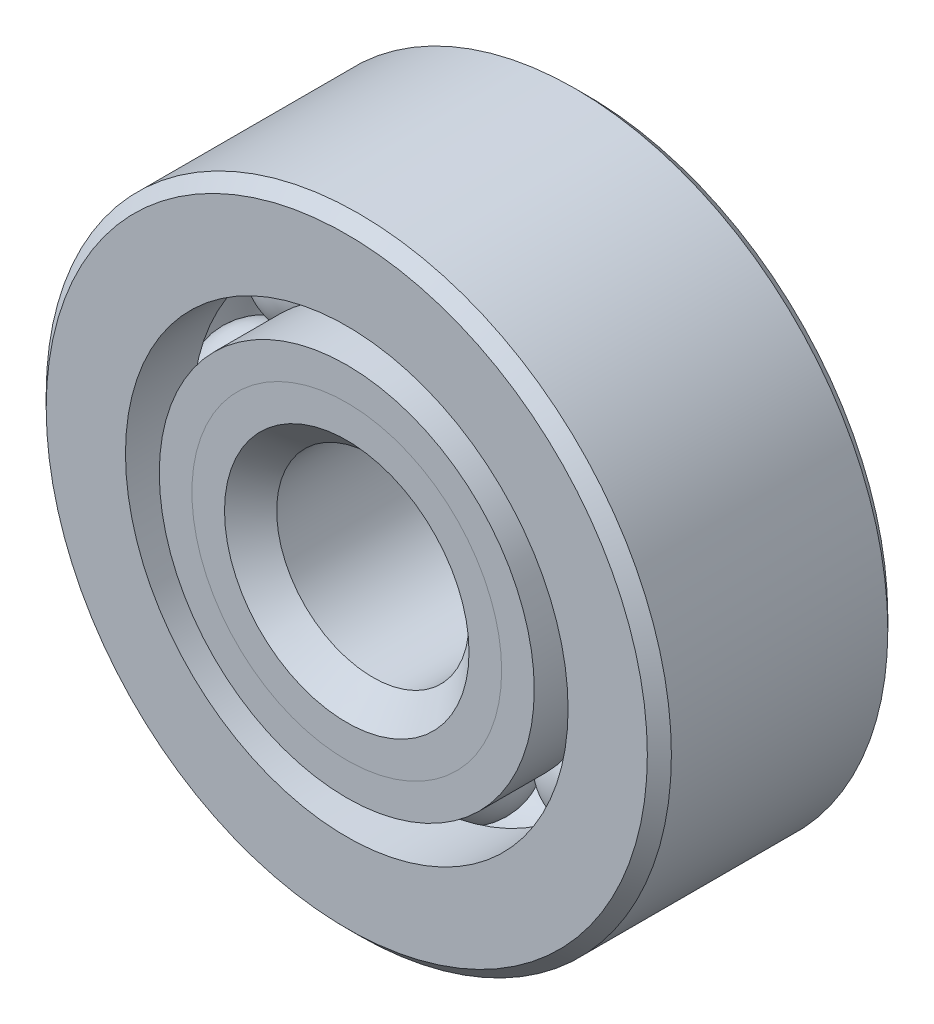
ISO-10303-21;
HEADER;
FILE_DESCRIPTION(('STEP AP214'),'2;1');
FILE_NAME('part.step','',(''),(''),'','','');
FILE_SCHEMA(('AUTOMOTIVE_DESIGN { 1 0 10303 214 1 1 1 1 }'));
ENDSEC;
DATA;
#1=APPLICATION_CONTEXT('core data for automotive mechanical design processes');
#2=APPLICATION_PROTOCOL_DEFINITION('international standard','automotive_design',2000,#1);
#3=PRODUCT_CONTEXT('',#1,'mechanical');
#4=PRODUCT('Part','Part','',(#3));
#5=PRODUCT_RELATED_PRODUCT_CATEGORY('part','',(#4));
#6=PRODUCT_DEFINITION_FORMATION('','',#4);
#7=PRODUCT_DEFINITION_CONTEXT('part definition',#1,'design');
#8=PRODUCT_DEFINITION('design','',#6,#7);
#9=PRODUCT_DEFINITION_SHAPE('','',#8);
#10=(LENGTH_UNIT() NAMED_UNIT(*) SI_UNIT(.MILLI.,.METRE.));
#11=(NAMED_UNIT(*) PLANE_ANGLE_UNIT() SI_UNIT($,.RADIAN.));
#12=(NAMED_UNIT(*) SI_UNIT($,.STERADIAN.) SOLID_ANGLE_UNIT());
#13=UNCERTAINTY_MEASURE_WITH_UNIT(LENGTH_MEASURE(1.E-05),#10,'distance_accuracy_value','');
#14=(GEOMETRIC_REPRESENTATION_CONTEXT(3) GLOBAL_UNCERTAINTY_ASSIGNED_CONTEXT((#13)) GLOBAL_UNIT_ASSIGNED_CONTEXT((#10,
#11,#12)) REPRESENTATION_CONTEXT('',''));
#15=CARTESIAN_POINT('',(0.,0.,0.));
#16=DIRECTION('',(0.,0.,1.));
#17=DIRECTION('',(1.,0.,0.));
#18=AXIS2_PLACEMENT_3D('',#15,#16,#17);
#19=CARTESIAN_POINT('',(-3.00520382004279,3.00520382004286,0.));
#20=DIRECTION('',(0.,0.,1.));
#21=DIRECTION('',(-0.707106781186539,0.707106781186556,0.));
#22=AXIS2_PLACEMENT_3D('',#19,#20,#21);
#23=SPHERICAL_SURFACE('',#22,1.16542887575844);
#24=CARTESIAN_POINT('',(-3.00520382004279,3.00520382004286,1.16542887575843));
#25=VERTEX_POINT('',#24);
#26=VERTEX_LOOP('',#25);
#27=FACE_BOUND('',#26,.T.);
#28=ADVANCED_FACE('F46',(#27),#23,.T.);
#29=CLOSED_SHELL('',(#28));
#30=MANIFOLD_SOLID_BREP('B2',#29);
#31=CARTESIAN_POINT('',(-4.25,0.,0.));
#32=DIRECTION('',(0.,0.,1.));
#33=DIRECTION('',(-1.,0.,0.));
#34=AXIS2_PLACEMENT_3D('',#31,#32,#33);
#35=SPHERICAL_SURFACE('',#34,1.16542887575844);
#36=CARTESIAN_POINT('',(-4.25,0.,1.16542887575843));
#37=VERTEX_POINT('',#36);
#38=VERTEX_LOOP('',#37);
#39=FACE_BOUND('',#38,.T.);
#40=ADVANCED_FACE('F83',(#39),#35,.T.);
#41=CLOSED_SHELL('',(#40));
#42=MANIFOLD_SOLID_BREP('B6',#41);
#43=CARTESIAN_POINT('',(-3.00520382004285,-3.0052038200428,0.));
#44=DIRECTION('',(0.,0.,1.));
#45=DIRECTION('',(-0.707106781186554,-0.707106781186541,0.));
#46=AXIS2_PLACEMENT_3D('',#43,#44,#45);
#47=SPHERICAL_SURFACE('',#46,1.16542887575844);
#48=CARTESIAN_POINT('',(-3.00520382004285,-3.0052038200428,1.16542887575843));
#49=VERTEX_POINT('',#48);
#50=VERTEX_LOOP('',#49);
#51=FACE_BOUND('',#50,.T.);
#52=ADVANCED_FACE('F120',(#51),#47,.T.);
#53=CLOSED_SHELL('',(#52));
#54=MANIFOLD_SOLID_BREP('B42',#53);
#55=CARTESIAN_POINT('',(0.,-4.25,0.));
#56=DIRECTION('',(0.,0.,1.));
#57=DIRECTION('',(0.,-1.,0.));
#58=AXIS2_PLACEMENT_3D('',#55,#56,#57);
#59=SPHERICAL_SURFACE('',#58,1.16542887575844);
#60=CARTESIAN_POINT('',(0.,-4.25,1.16542887575843));
#61=VERTEX_POINT('',#60);
#62=VERTEX_LOOP('',#61);
#63=FACE_BOUND('',#62,.T.);
#64=ADVANCED_FACE('F157',(#63),#59,.T.);
#65=CLOSED_SHELL('',(#64));
#66=MANIFOLD_SOLID_BREP('B79',#65);
#67=CARTESIAN_POINT('',(3.00520382004281,-3.00520382004284,0.));
#68=DIRECTION('',(0.,0.,1.));
#69=DIRECTION('',(0.707106781186544,-0.707106781186551,0.));
#70=AXIS2_PLACEMENT_3D('',#67,#68,#69);
#71=SPHERICAL_SURFACE('',#70,1.16542887575844);
#72=CARTESIAN_POINT('',(3.00520382004281,-3.00520382004284,1.16542887575843));
#73=VERTEX_POINT('',#72);
#74=VERTEX_LOOP('',#73);
#75=FACE_BOUND('',#74,.T.);
#76=ADVANCED_FACE('F194',(#75),#71,.T.);
#77=CLOSED_SHELL('',(#76));
#78=MANIFOLD_SOLID_BREP('B116',#77);
#79=CARTESIAN_POINT('',(4.25,0.,0.));
#80=DIRECTION('',(0.,0.,1.));
#81=DIRECTION('',(1.,0.,0.));
#82=AXIS2_PLACEMENT_3D('',#79,#80,#81);
#83=SPHERICAL_SURFACE('',#82,1.16542887575844);
#84=CARTESIAN_POINT('',(4.25,0.,1.16542887575843));
#85=VERTEX_POINT('',#84);
#86=VERTEX_LOOP('',#85);
#87=FACE_BOUND('',#86,.T.);
#88=ADVANCED_FACE('F231',(#87),#83,.T.);
#89=CLOSED_SHELL('',(#88));
#90=MANIFOLD_SOLID_BREP('B153',#89);
#91=CARTESIAN_POINT('',(3.00520382004283,3.00520382004282,0.));
#92=DIRECTION('',(0.,0.,1.));
#93=DIRECTION('',(0.707106781186549,0.707106781186546,0.));
#94=AXIS2_PLACEMENT_3D('',#91,#92,#93);
#95=SPHERICAL_SURFACE('',#94,1.16542887575844);
#96=CARTESIAN_POINT('',(3.00520382004283,3.00520382004282,1.16542887575843));
#97=VERTEX_POINT('',#96);
#98=VERTEX_LOOP('',#97);
#99=FACE_BOUND('',#98,.T.);
#100=ADVANCED_FACE('F268',(#99),#95,.T.);
#101=CLOSED_SHELL('',(#100));
#102=MANIFOLD_SOLID_BREP('B190',#101);
#103=CARTESIAN_POINT('',(0.,4.25,0.));
#104=DIRECTION('',(0.,0.,1.));
#105=DIRECTION('',(0.,1.,0.));
#106=AXIS2_PLACEMENT_3D('',#103,#104,#105);
#107=SPHERICAL_SURFACE('',#106,1.16542887575844);
#108=CARTESIAN_POINT('',(0.,4.25,1.16542887575843));
#109=VERTEX_POINT('',#108);
#110=VERTEX_LOOP('',#109);
#111=FACE_BOUND('',#110,.T.);
#112=ADVANCED_FACE('F307',(#111),#107,.T.);
#113=CLOSED_SHELL('',(#112));
#114=MANIFOLD_SOLID_BREP('B227',#113);
#115=CARTESIAN_POINT('',(0.,3.22031860523622,2.5));
#116=DIRECTION('',(0.,0.,-1.));
#117=DIRECTION('',(-1.,0.,0.));
#118=AXIS2_PLACEMENT_3D('',#115,#116,#117);
#119=PLANE('',#118);
#120=CARTESIAN_POINT('',(0.,0.,2.5));
#121=DIRECTION('',(0.,0.,1.));
#122=DIRECTION('',(1.,0.,0.));
#123=AXIS2_PLACEMENT_3D('',#120,#121,#122);
#124=CIRCLE('',#123,2.54228556212078);
#125=CARTESIAN_POINT('',(2.54228556212078,0.,2.5));
#126=VERTEX_POINT('',#125);
#127=EDGE_CURVE('E373',#126,#126,#124,.T.);
#128=ORIENTED_EDGE('',*,*,#127,.F.);
#129=EDGE_LOOP('',(#128));
#130=FACE_BOUND('',#129,.T.);
#131=CARTESIAN_POINT('',(0.,0.,2.5));
#132=DIRECTION('',(0.,0.,1.));
#133=DIRECTION('',(1.,0.,0.));
#134=AXIS2_PLACEMENT_3D('',#131,#132,#133);
#135=CIRCLE('',#134,3.22031860523622);
#136=CARTESIAN_POINT('',(3.22031860523622,0.,2.5));
#137=VERTEX_POINT('',#136);
#138=EDGE_CURVE('E306',#137,#137,#135,.T.);
#139=ORIENTED_EDGE('',*,*,#138,.T.);
#140=EDGE_LOOP('',(#139));
#141=FACE_BOUND('',#140,.T.);
#142=ADVANCED_FACE('F328',(#130,#141),#119,.F.);
#143=CARTESIAN_POINT('',(0.,0.,1.82196695688457));
#144=DIRECTION('',(0.,0.,1.));
#145=DIRECTION('',(1.,0.,0.));
#146=AXIS2_PLACEMENT_3D('',#143,#144,#145);
#147=CONICAL_SURFACE('',#146,2.54228556212078,0.78539816339745);
#148=ORIENTED_EDGE('',*,*,#138,.F.);
#149=EDGE_LOOP('',(#148));
#150=FACE_BOUND('',#149,.T.);
#151=CARTESIAN_POINT('',(0.,0.,1.82196695688457));
#152=DIRECTION('',(0.,0.,1.));
#153=DIRECTION('',(1.,0.,0.));
#154=AXIS2_PLACEMENT_3D('',#151,#152,#153);
#155=CIRCLE('',#154,2.54228556212078);
#156=CARTESIAN_POINT('',(2.54228556212078,0.,1.82196695688457));
#157=VERTEX_POINT('',#156);
#158=EDGE_CURVE('E335',#157,#157,#155,.T.);
#159=ORIENTED_EDGE('',*,*,#158,.T.);
#160=EDGE_LOOP('',(#159));
#161=FACE_BOUND('',#160,.T.);
#162=ADVANCED_FACE('F382',(#150,#161),#147,.T.);
#163=CARTESIAN_POINT('',(0.,0.,2.5));
#164=DIRECTION('',(0.,0.,1.));
#165=DIRECTION('',(1.,0.,0.));
#166=AXIS2_PLACEMENT_3D('',#163,#164,#165);
#167=CYLINDRICAL_SURFACE('',#166,2.54228556212078);
#168=ORIENTED_EDGE('',*,*,#158,.F.);
#169=EDGE_LOOP('',(#168));
#170=FACE_BOUND('',#169,.T.);
#171=CARTESIAN_POINT('',(0.,0.,0.));
#172=DIRECTION('',(0.,0.,1.));
#173=DIRECTION('',(1.,0.,0.));
#174=AXIS2_PLACEMENT_3D('',#171,#172,#173);
#175=CIRCLE('',#174,2.54228556212078);
#176=CARTESIAN_POINT('',(2.54228556212078,0.,0.));
#177=VERTEX_POINT('',#176);
#178=EDGE_CURVE('E341',#177,#177,#175,.T.);
#179=ORIENTED_EDGE('',*,*,#178,.T.);
#180=EDGE_LOOP('',(#179));
#181=FACE_BOUND('',#180,.T.);
#182=ADVANCED_FACE('F386',(#170,#181),#167,.T.);
#183=CARTESIAN_POINT('',(0.,2.54228556212078,0.));
#184=DIRECTION('',(0.,0.,-1.));
#185=DIRECTION('',(-1.,0.,0.));
#186=AXIS2_PLACEMENT_3D('',#183,#184,#185);
#187=PLANE('',#186);
#188=ORIENTED_EDGE('',*,*,#178,.F.);
#189=EDGE_LOOP('',(#188));
#190=FACE_BOUND('',#189,.T.);
#191=CARTESIAN_POINT('',(0.,0.,0.));
#192=DIRECTION('',(0.,0.,1.));
#193=DIRECTION('',(1.,0.,0.));
#194=AXIS2_PLACEMENT_3D('',#191,#192,#193);
#195=CIRCLE('',#194,3.08457112424157);
#196=CARTESIAN_POINT('',(3.08457112424157,0.,0.));
#197=VERTEX_POINT('',#196);
#198=EDGE_CURVE('E347',#197,#197,#195,.T.);
#199=ORIENTED_EDGE('',*,*,#198,.T.);
#200=EDGE_LOOP('',(#199));
#201=FACE_BOUND('',#200,.T.);
#202=ADVANCED_FACE('F391',(#190,#201),#187,.F.);
#203=CARTESIAN_POINT('',(0.,0.,0.));
#204=DIRECTION('',(0.,0.,1.));
#205=DIRECTION('',(1.,0.,0.));
#206=AXIS2_PLACEMENT_3D('',#203,#204,#205);
#207=TOROIDAL_SURFACE('',#206,4.25,1.16542887575843);
#208=ORIENTED_EDGE('',*,*,#198,.F.);
#209=EDGE_LOOP('',(#208));
#210=FACE_BOUND('',#209,.T.);
#211=CARTESIAN_POINT('',(0.,0.,-1.11111111111111));
#212=DIRECTION('',(0.,0.,1.));
#213=DIRECTION('',(1.,0.,0.));
#214=AXIS2_PLACEMENT_3D('',#211,#212,#213);
#215=CIRCLE('',#214,3.89835164835165);
#216=CARTESIAN_POINT('',(3.89835164835165,0.,-1.11111111111111));
#217=VERTEX_POINT('',#216);
#218=EDGE_CURVE('E353',#217,#217,#215,.T.);
#219=ORIENTED_EDGE('',*,*,#218,.T.);
#220=EDGE_LOOP('',(#219));
#221=FACE_BOUND('',#220,.T.);
#222=ADVANCED_FACE('F397',(#210,#221),#207,.F.);
#223=CARTESIAN_POINT('',(0.,0.,2.5));
#224=DIRECTION('',(0.,0.,1.));
#225=DIRECTION('',(1.,0.,0.));
#226=AXIS2_PLACEMENT_3D('',#223,#224,#225);
#227=CYLINDRICAL_SURFACE('',#226,3.89835164835165);
#228=ORIENTED_EDGE('',*,*,#218,.F.);
#229=EDGE_LOOP('',(#228));
#230=FACE_BOUND('',#229,.T.);
#231=CARTESIAN_POINT('',(0.,0.,-2.5));
#232=DIRECTION('',(0.,0.,1.));
#233=DIRECTION('',(1.,0.,0.));
#234=AXIS2_PLACEMENT_3D('',#231,#232,#233);
#235=CIRCLE('',#234,3.89835164835165);
#236=CARTESIAN_POINT('',(3.89835164835165,0.,-2.5));
#237=VERTEX_POINT('',#236);
#238=EDGE_CURVE('E357',#237,#237,#235,.T.);
#239=ORIENTED_EDGE('',*,*,#238,.T.);
#240=EDGE_LOOP('',(#239));
#241=FACE_BOUND('',#240,.T.);
#242=ADVANCED_FACE('F401',(#230,#241),#227,.T.);
#243=CARTESIAN_POINT('',(0.,2.25,-2.5));
#244=DIRECTION('',(0.,0.,1.));
#245=DIRECTION('',(1.,0.,0.));
#246=AXIS2_PLACEMENT_3D('',#243,#244,#245);
#247=PLANE('',#246);
#248=ORIENTED_EDGE('',*,*,#238,.F.);
#249=EDGE_LOOP('',(#248));
#250=FACE_BOUND('',#249,.T.);
#251=CARTESIAN_POINT('',(0.,0.,-2.5));
#252=DIRECTION('',(0.,0.,1.));
#253=DIRECTION('',(1.,0.,0.));
#254=AXIS2_PLACEMENT_3D('',#251,#252,#253);
#255=CIRCLE('',#254,2.25);
#256=CARTESIAN_POINT('',(2.25,0.,-2.5));
#257=VERTEX_POINT('',#256);
#258=EDGE_CURVE('E361',#257,#257,#255,.T.);
#259=ORIENTED_EDGE('',*,*,#258,.T.);
#260=EDGE_LOOP('',(#259));
#261=FACE_BOUND('',#260,.T.);
#262=ADVANCED_FACE('F405',(#250,#261),#247,.F.);
#263=CARTESIAN_POINT('',(0.,0.,-2.25));
#264=DIRECTION('',(0.,0.,-1.));
#265=DIRECTION('',(-1.,0.,0.));
#266=AXIS2_PLACEMENT_3D('',#263,#264,#265);
#267=CONICAL_SURFACE('',#266,2.,0.785398163397448);
#268=ORIENTED_EDGE('',*,*,#258,.F.);
#269=EDGE_LOOP('',(#268));
#270=FACE_BOUND('',#269,.T.);
#271=CARTESIAN_POINT('',(0.,0.,-2.25));
#272=DIRECTION('',(0.,0.,1.));
#273=DIRECTION('',(1.,0.,0.));
#274=AXIS2_PLACEMENT_3D('',#271,#272,#273);
#275=CIRCLE('',#274,2.);
#276=CARTESIAN_POINT('',(2.,0.,-2.25));
#277=VERTEX_POINT('',#276);
#278=EDGE_CURVE('E365',#277,#277,#275,.T.);
#279=ORIENTED_EDGE('',*,*,#278,.T.);
#280=EDGE_LOOP('',(#279));
#281=FACE_BOUND('',#280,.T.);
#282=ADVANCED_FACE('F409',(#270,#281),#267,.F.);
#283=CARTESIAN_POINT('',(0.,0.,2.5));
#284=DIRECTION('',(0.,0.,1.));
#285=DIRECTION('',(1.,0.,0.));
#286=AXIS2_PLACEMENT_3D('',#283,#284,#285);
#287=CYLINDRICAL_SURFACE('',#286,2.);
#288=ORIENTED_EDGE('',*,*,#278,.F.);
#289=EDGE_LOOP('',(#288));
#290=FACE_BOUND('',#289,.T.);
#291=CARTESIAN_POINT('',(0.,0.,1.95771443787922));
#292=DIRECTION('',(0.,0.,1.));
#293=DIRECTION('',(1.,0.,0.));
#294=AXIS2_PLACEMENT_3D('',#291,#292,#293);
#295=CIRCLE('',#294,2.);
#296=CARTESIAN_POINT('',(2.,0.,1.95771443787922));
#297=VERTEX_POINT('',#296);
#298=EDGE_CURVE('E369',#297,#297,#295,.T.);
#299=ORIENTED_EDGE('',*,*,#298,.T.);
#300=EDGE_LOOP('',(#299));
#301=FACE_BOUND('',#300,.T.);
#302=ADVANCED_FACE('F413',(#290,#301),#287,.F.);
#303=CARTESIAN_POINT('',(0.,0.,2.5));
#304=DIRECTION('',(0.,0.,1.));
#305=DIRECTION('',(1.,0.,0.));
#306=AXIS2_PLACEMENT_3D('',#303,#304,#305);
#307=CONICAL_SURFACE('',#306,2.54228556212078,0.78539816339745);
#308=ORIENTED_EDGE('',*,*,#298,.F.);
#309=EDGE_LOOP('',(#308));
#310=FACE_BOUND('',#309,.T.);
#311=ORIENTED_EDGE('',*,*,#127,.T.);
#312=EDGE_LOOP('',(#311));
#313=FACE_BOUND('',#312,.T.);
#314=ADVANCED_FACE('F379',(#310,#313),#307,.F.);
#315=CLOSED_SHELL('',(#142,#162,#182,#202,#222,#242,#262,#282,#302,#314));
#316=MANIFOLD_SOLID_BREP('B264',#315);
#317=CARTESIAN_POINT('',(0.,3.89835164835165,2.5));
#318=DIRECTION('',(0.,0.,-1.));
#319=DIRECTION('',(-1.,0.,0.));
#320=AXIS2_PLACEMENT_3D('',#317,#318,#319);
#321=PLANE('',#320);
#322=CARTESIAN_POINT('',(0.,0.,2.5));
#323=DIRECTION('',(0.,0.,1.));
#324=DIRECTION('',(1.,0.,0.));
#325=AXIS2_PLACEMENT_3D('',#322,#323,#324);
#326=CIRCLE('',#325,3.22031860523622);
#327=CARTESIAN_POINT('',(3.22031860523622,0.,2.5));
#328=VERTEX_POINT('',#327);
#329=EDGE_CURVE('E327',#328,#328,#326,.T.);
#330=ORIENTED_EDGE('',*,*,#329,.F.);
#331=EDGE_LOOP('',(#330));
#332=FACE_BOUND('',#331,.T.);
#333=CARTESIAN_POINT('',(0.,0.,2.5));
#334=DIRECTION('',(0.,0.,1.));
#335=DIRECTION('',(1.,0.,0.));
#336=AXIS2_PLACEMENT_3D('',#333,#334,#335);
#337=CIRCLE('',#336,3.89835164835165);
#338=CARTESIAN_POINT('',(3.89835164835165,0.,2.5));
#339=VERTEX_POINT('',#338);
#340=EDGE_CURVE('E536',#339,#339,#337,.T.);
#341=ORIENTED_EDGE('',*,*,#340,.T.);
#342=EDGE_LOOP('',(#341));
#343=FACE_BOUND('',#342,.T.);
#344=ADVANCED_FACE('F507',(#332,#343),#321,.F.);
#345=CARTESIAN_POINT('',(0.,0.,2.5));
#346=DIRECTION('',(0.,0.,1.));
#347=DIRECTION('',(1.,0.,0.));
#348=AXIS2_PLACEMENT_3D('',#345,#346,#347);
#349=CONICAL_SURFACE('',#348,3.22031860523622,0.78539816339745);
#350=CARTESIAN_POINT('',(0.,0.,1.82196695688457));
#351=DIRECTION('',(0.,0.,1.));
#352=DIRECTION('',(1.,0.,0.));
#353=AXIS2_PLACEMENT_3D('',#350,#351,#352);
#354=CIRCLE('',#353,2.54228556212078);
#355=CARTESIAN_POINT('',(2.54228556212078,0.,1.82196695688457));
#356=VERTEX_POINT('',#355);
#357=EDGE_CURVE('E514',#356,#356,#354,.T.);
#358=ORIENTED_EDGE('',*,*,#357,.F.);
#359=EDGE_LOOP('',(#358));
#360=FACE_BOUND('',#359,.T.);
#361=ORIENTED_EDGE('',*,*,#329,.T.);
#362=EDGE_LOOP('',(#361));
#363=FACE_BOUND('',#362,.T.);
#364=ADVANCED_FACE('F563',(#360,#363),#349,.F.);
#365=CARTESIAN_POINT('',(0.,0.,2.5));
#366=DIRECTION('',(0.,0.,1.));
#367=DIRECTION('',(1.,0.,0.));
#368=AXIS2_PLACEMENT_3D('',#365,#366,#367);
#369=CYLINDRICAL_SURFACE('',#368,2.54228556212078);
#370=CARTESIAN_POINT('',(0.,0.,0.));
#371=DIRECTION('',(0.,0.,1.));
#372=DIRECTION('',(1.,0.,0.));
#373=AXIS2_PLACEMENT_3D('',#370,#371,#372);
#374=CIRCLE('',#373,2.54228556212078);
#375=CARTESIAN_POINT('',(2.54228556212078,0.,0.));
#376=VERTEX_POINT('',#375);
#377=EDGE_CURVE('E520',#376,#376,#374,.T.);
#378=ORIENTED_EDGE('',*,*,#377,.F.);
#379=EDGE_LOOP('',(#378));
#380=FACE_BOUND('',#379,.T.);
#381=ORIENTED_EDGE('',*,*,#357,.T.);
#382=EDGE_LOOP('',(#381));
#383=FACE_BOUND('',#382,.T.);
#384=ADVANCED_FACE('F558',(#380,#383),#369,.F.);
#385=CARTESIAN_POINT('',(0.,2.54228556212078,0.));
#386=DIRECTION('',(0.,0.,1.));
#387=DIRECTION('',(1.,0.,0.));
#388=AXIS2_PLACEMENT_3D('',#385,#386,#387);
#389=PLANE('',#388);
#390=CARTESIAN_POINT('',(0.,0.,0.));
#391=DIRECTION('',(0.,0.,1.));
#392=DIRECTION('',(1.,0.,0.));
#393=AXIS2_PLACEMENT_3D('',#390,#391,#392);
#394=CIRCLE('',#393,3.08457112424157);
#395=CARTESIAN_POINT('',(3.08457112424157,0.,0.));
#396=VERTEX_POINT('',#395);
#397=EDGE_CURVE('E526',#396,#396,#394,.T.);
#398=ORIENTED_EDGE('',*,*,#397,.F.);
#399=EDGE_LOOP('',(#398));
#400=FACE_BOUND('',#399,.T.);
#401=ORIENTED_EDGE('',*,*,#377,.T.);
#402=EDGE_LOOP('',(#401));
#403=FACE_BOUND('',#402,.T.);
#404=ADVANCED_FACE('F552',(#400,#403),#389,.F.);
#405=CARTESIAN_POINT('',(0.,0.,0.));
#406=DIRECTION('',(0.,0.,1.));
#407=DIRECTION('',(1.,0.,0.));
#408=AXIS2_PLACEMENT_3D('',#405,#406,#407);
#409=TOROIDAL_SURFACE('',#408,4.25,1.16542887575844);
#410=CARTESIAN_POINT('',(0.,0.,1.11111111111111));
#411=DIRECTION('',(0.,0.,1.));
#412=DIRECTION('',(1.,0.,0.));
#413=AXIS2_PLACEMENT_3D('',#410,#411,#412);
#414=CIRCLE('',#413,3.89835164835165);
#415=CARTESIAN_POINT('',(3.89835164835165,0.,1.11111111111111));
#416=VERTEX_POINT('',#415);
#417=EDGE_CURVE('E532',#416,#416,#414,.T.);
#418=ORIENTED_EDGE('',*,*,#417,.F.);
#419=EDGE_LOOP('',(#418));
#420=FACE_BOUND('',#419,.T.);
#421=ORIENTED_EDGE('',*,*,#397,.T.);
#422=EDGE_LOOP('',(#421));
#423=FACE_BOUND('',#422,.T.);
#424=ADVANCED_FACE('F546',(#420,#423),#409,.F.);
#425=CARTESIAN_POINT('',(0.,0.,2.5));
#426=DIRECTION('',(0.,0.,1.));
#427=DIRECTION('',(1.,0.,0.));
#428=AXIS2_PLACEMENT_3D('',#425,#426,#427);
#429=CYLINDRICAL_SURFACE('',#428,3.89835164835165);
#430=ORIENTED_EDGE('',*,*,#340,.F.);
#431=EDGE_LOOP('',(#430));
#432=FACE_BOUND('',#431,.T.);
#433=ORIENTED_EDGE('',*,*,#417,.T.);
#434=EDGE_LOOP('',(#433));
#435=FACE_BOUND('',#434,.T.);
#436=ADVANCED_FACE('F543',(#432,#435),#429,.T.);
#437=CLOSED_SHELL('',(#344,#364,#384,#404,#424,#436));
#438=MANIFOLD_SOLID_BREP('B301',#437);
#439=CARTESIAN_POINT('',(0.,0.,2.25));
#440=DIRECTION('',(0.,0.,-1.));
#441=DIRECTION('',(-1.,0.,0.));
#442=AXIS2_PLACEMENT_3D('',#439,#440,#441);
#443=CONICAL_SURFACE('',#442,6.5,0.785398163397445);
#444=CARTESIAN_POINT('',(0.,0.,2.5));
#445=DIRECTION('',(0.,0.,1.));
#446=DIRECTION('',(1.,0.,0.));
#447=AXIS2_PLACEMENT_3D('',#444,#445,#446);
#448=CIRCLE('',#447,6.25);
#449=CARTESIAN_POINT('',(6.25,0.,2.5));
#450=VERTEX_POINT('',#449);
#451=EDGE_CURVE('E648',#450,#450,#448,.T.);
#452=ORIENTED_EDGE('',*,*,#451,.F.);
#453=EDGE_LOOP('',(#452));
#454=FACE_BOUND('',#453,.T.);
#455=CARTESIAN_POINT('',(0.,0.,2.25));
#456=DIRECTION('',(0.,0.,1.));
#457=DIRECTION('',(1.,0.,0.));
#458=AXIS2_PLACEMENT_3D('',#455,#456,#457);
#459=CIRCLE('',#458,6.5);
#460=CARTESIAN_POINT('',(6.5,0.,2.25));
#461=VERTEX_POINT('',#460);
#462=EDGE_CURVE('E506',#461,#461,#459,.T.);
#463=ORIENTED_EDGE('',*,*,#462,.T.);
#464=EDGE_LOOP('',(#463));
#465=FACE_BOUND('',#464,.T.);
#466=ADVANCED_FACE('F611',(#454,#465),#443,.T.);
#467=CARTESIAN_POINT('',(0.,0.,2.5));
#468=DIRECTION('',(0.,0.,1.));
#469=DIRECTION('',(1.,0.,0.));
#470=AXIS2_PLACEMENT_3D('',#467,#468,#469);
#471=CYLINDRICAL_SURFACE('',#470,6.5);
#472=ORIENTED_EDGE('',*,*,#462,.F.);
#473=EDGE_LOOP('',(#472));
#474=FACE_BOUND('',#473,.T.);
#475=CARTESIAN_POINT('',(0.,0.,-2.25));
#476=DIRECTION('',(0.,0.,1.));
#477=DIRECTION('',(1.,0.,0.));
#478=AXIS2_PLACEMENT_3D('',#475,#476,#477);
#479=CIRCLE('',#478,6.5);
#480=CARTESIAN_POINT('',(6.5,0.,-2.25));
#481=VERTEX_POINT('',#480);
#482=EDGE_CURVE('E618',#481,#481,#479,.T.);
#483=ORIENTED_EDGE('',*,*,#482,.T.);
#484=EDGE_LOOP('',(#483));
#485=FACE_BOUND('',#484,.T.);
#486=ADVANCED_FACE('F657',(#474,#485),#471,.T.);
#487=CARTESIAN_POINT('',(0.,0.,-2.5));
#488=DIRECTION('',(0.,0.,1.));
#489=DIRECTION('',(1.,0.,0.));
#490=AXIS2_PLACEMENT_3D('',#487,#488,#489);
#491=CONICAL_SURFACE('',#490,6.25,0.785398163397445);
#492=ORIENTED_EDGE('',*,*,#482,.F.);
#493=EDGE_LOOP('',(#492));
#494=FACE_BOUND('',#493,.T.);
#495=CARTESIAN_POINT('',(0.,0.,-2.5));
#496=DIRECTION('',(0.,0.,1.));
#497=DIRECTION('',(1.,0.,0.));
#498=AXIS2_PLACEMENT_3D('',#495,#496,#497);
#499=CIRCLE('',#498,6.25);
#500=CARTESIAN_POINT('',(6.25,0.,-2.5));
#501=VERTEX_POINT('',#500);
#502=EDGE_CURVE('E624',#501,#501,#499,.T.);
#503=ORIENTED_EDGE('',*,*,#502,.T.);
#504=EDGE_LOOP('',(#503));
#505=FACE_BOUND('',#504,.T.);
#506=ADVANCED_FACE('F661',(#494,#505),#491,.T.);
#507=CARTESIAN_POINT('',(0.,6.25,-2.5));
#508=DIRECTION('',(0.,0.,1.));
#509=DIRECTION('',(1.,0.,0.));
#510=AXIS2_PLACEMENT_3D('',#507,#508,#509);
#511=PLANE('',#510);
#512=ORIENTED_EDGE('',*,*,#502,.F.);
#513=EDGE_LOOP('',(#512));
#514=FACE_BOUND('',#513,.T.);
#515=CARTESIAN_POINT('',(0.,0.,-2.5));
#516=DIRECTION('',(0.,0.,1.));
#517=DIRECTION('',(1.,0.,0.));
#518=AXIS2_PLACEMENT_3D('',#515,#516,#517);
#519=CIRCLE('',#518,4.60164835164835);
#520=CARTESIAN_POINT('',(4.60164835164835,0.,-2.5));
#521=VERTEX_POINT('',#520);
#522=EDGE_CURVE('E630',#521,#521,#519,.T.);
#523=ORIENTED_EDGE('',*,*,#522,.T.);
#524=EDGE_LOOP('',(#523));
#525=FACE_BOUND('',#524,.T.);
#526=ADVANCED_FACE('F666',(#514,#525),#511,.F.);
#527=CARTESIAN_POINT('',(0.,0.,2.5));
#528=DIRECTION('',(0.,0.,1.));
#529=DIRECTION('',(1.,0.,0.));
#530=AXIS2_PLACEMENT_3D('',#527,#528,#529);
#531=CYLINDRICAL_SURFACE('',#530,4.60164835164835);
#532=ORIENTED_EDGE('',*,*,#522,.F.);
#533=EDGE_LOOP('',(#532));
#534=FACE_BOUND('',#533,.T.);
#535=CARTESIAN_POINT('',(0.,0.,-1.11111111111111));
#536=DIRECTION('',(0.,0.,1.));
#537=DIRECTION('',(1.,0.,0.));
#538=AXIS2_PLACEMENT_3D('',#535,#536,#537);
#539=CIRCLE('',#538,4.60164835164835);
#540=CARTESIAN_POINT('',(4.60164835164835,0.,-1.11111111111111));
#541=VERTEX_POINT('',#540);
#542=EDGE_CURVE('E636',#541,#541,#539,.T.);
#543=ORIENTED_EDGE('',*,*,#542,.T.);
#544=EDGE_LOOP('',(#543));
#545=FACE_BOUND('',#544,.T.);
#546=ADVANCED_FACE('F672',(#534,#545),#531,.F.);
#547=CARTESIAN_POINT('',(0.,0.,0.));
#548=DIRECTION('',(0.,0.,1.));
#549=DIRECTION('',(1.,0.,0.));
#550=AXIS2_PLACEMENT_3D('',#547,#548,#549);
#551=TOROIDAL_SURFACE('',#550,4.25,1.16542887575844);
#552=ORIENTED_EDGE('',*,*,#542,.F.);
#553=EDGE_LOOP('',(#552));
#554=FACE_BOUND('',#553,.T.);
#555=CARTESIAN_POINT('',(0.,0.,1.11111111111111));
#556=DIRECTION('',(0.,0.,1.));
#557=DIRECTION('',(1.,0.,0.));
#558=AXIS2_PLACEMENT_3D('',#555,#556,#557);
#559=CIRCLE('',#558,4.60164835164835);
#560=CARTESIAN_POINT('',(4.60164835164835,0.,1.11111111111111));
#561=VERTEX_POINT('',#560);
#562=EDGE_CURVE('E640',#561,#561,#559,.T.);
#563=ORIENTED_EDGE('',*,*,#562,.T.);
#564=EDGE_LOOP('',(#563));
#565=FACE_BOUND('',#564,.T.);
#566=ADVANCED_FACE('F676',(#554,#565),#551,.F.);
#567=CARTESIAN_POINT('',(0.,0.,2.5));
#568=DIRECTION('',(0.,0.,1.));
#569=DIRECTION('',(1.,0.,0.));
#570=AXIS2_PLACEMENT_3D('',#567,#568,#569);
#571=CYLINDRICAL_SURFACE('',#570,4.60164835164835);
#572=ORIENTED_EDGE('',*,*,#562,.F.);
#573=EDGE_LOOP('',(#572));
#574=FACE_BOUND('',#573,.T.);
#575=CARTESIAN_POINT('',(0.,0.,2.5));
#576=DIRECTION('',(0.,0.,1.));
#577=DIRECTION('',(1.,0.,0.));
#578=AXIS2_PLACEMENT_3D('',#575,#576,#577);
#579=CIRCLE('',#578,4.60164835164835);
#580=CARTESIAN_POINT('',(4.60164835164835,0.,2.5));
#581=VERTEX_POINT('',#580);
#582=EDGE_CURVE('E644',#581,#581,#579,.T.);
#583=ORIENTED_EDGE('',*,*,#582,.T.);
#584=EDGE_LOOP('',(#583));
#585=FACE_BOUND('',#584,.T.);
#586=ADVANCED_FACE('F680',(#574,#585),#571,.F.);
#587=CARTESIAN_POINT('',(0.,6.25,2.5));
#588=DIRECTION('',(0.,0.,-1.));
#589=DIRECTION('',(-1.,0.,0.));
#590=AXIS2_PLACEMENT_3D('',#587,#588,#589);
#591=PLANE('',#590);
#592=ORIENTED_EDGE('',*,*,#582,.F.);
#593=EDGE_LOOP('',(#592));
#594=FACE_BOUND('',#593,.T.);
#595=ORIENTED_EDGE('',*,*,#451,.T.);
#596=EDGE_LOOP('',(#595));
#597=FACE_BOUND('',#596,.T.);
#598=ADVANCED_FACE('F654',(#594,#597),#591,.F.);
#599=CLOSED_SHELL('',(#466,#486,#506,#526,#546,#566,#586,#598));
#600=MANIFOLD_SOLID_BREP('B322',#599);
#601=ADVANCED_BREP_SHAPE_REPRESENTATION('',(#18,#30,#42,#54,#66,#78,#90,#102,#114,#316,#438,
#600),#14);
#602=SHAPE_DEFINITION_REPRESENTATION(#9,#601);
ENDSEC;
END-ISO-10303-21;
